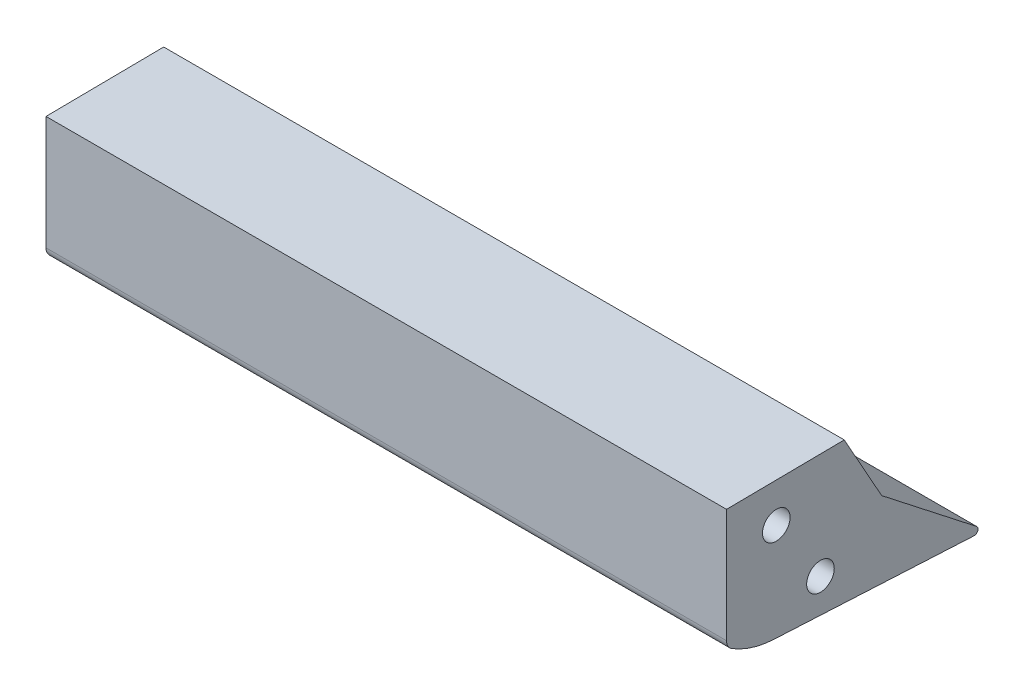
ISO-10303-21;
HEADER;
FILE_DESCRIPTION(('STEP AP214'),'2;1');
FILE_NAME('part.step','',(''),(''),'','','');
FILE_SCHEMA(('AUTOMOTIVE_DESIGN { 1 0 10303 214 1 1 1 1 }'));
ENDSEC;
DATA;
#1=APPLICATION_CONTEXT('core data for automotive mechanical design processes');
#2=APPLICATION_PROTOCOL_DEFINITION('international standard','automotive_design',2000,#1);
#3=PRODUCT_CONTEXT('',#1,'mechanical');
#4=PRODUCT('Part','Part','',(#3));
#5=PRODUCT_RELATED_PRODUCT_CATEGORY('part','',(#4));
#6=PRODUCT_DEFINITION_FORMATION('','',#4);
#7=PRODUCT_DEFINITION_CONTEXT('part definition',#1,'design');
#8=PRODUCT_DEFINITION('design','',#6,#7);
#9=PRODUCT_DEFINITION_SHAPE('','',#8);
#10=(LENGTH_UNIT() NAMED_UNIT(*) SI_UNIT(.MILLI.,.METRE.));
#11=(NAMED_UNIT(*) PLANE_ANGLE_UNIT() SI_UNIT($,.RADIAN.));
#12=(NAMED_UNIT(*) SI_UNIT($,.STERADIAN.) SOLID_ANGLE_UNIT());
#13=UNCERTAINTY_MEASURE_WITH_UNIT(LENGTH_MEASURE(1.E-05),#10,'distance_accuracy_value','');
#14=(GEOMETRIC_REPRESENTATION_CONTEXT(3) GLOBAL_UNCERTAINTY_ASSIGNED_CONTEXT((#13)) GLOBAL_UNIT_ASSIGNED_CONTEXT((#10,
#11,#12)) REPRESENTATION_CONTEXT('',''));
#15=CARTESIAN_POINT('',(0.,0.,0.));
#16=DIRECTION('',(0.,0.,1.));
#17=DIRECTION('',(1.,0.,0.));
#18=AXIS2_PLACEMENT_3D('',#15,#16,#17);
#19=CARTESIAN_POINT('',(31.3,-7.86547622084393,1.45));
#20=DIRECTION('',(0.,0.,-1.));
#21=DIRECTION('',(0.,1.,0.));
#22=AXIS2_PLACEMENT_3D('',#19,#20,#21);
#23=PLANE('',#22);
#24=DIRECTION('',(0.,1.,0.));
#25=VECTOR('',#24,1.);
#26=CARTESIAN_POINT('',(-30.8,-7.86547622084393,1.45));
#27=LINE('',#26,#25);
#28=CARTESIAN_POINT('',(-30.8,-18.1662266030795,1.45));
#29=VERTEX_POINT('',#28);
#30=CARTESIAN_POINT('',(-30.8,-7.86547622084393,1.45));
#31=VERTEX_POINT('',#30);
#32=EDGE_CURVE('E169',#29,#31,#27,.T.);
#33=ORIENTED_EDGE('',*,*,#32,.F.);
#34=DIRECTION('',(1.,0.,0.));
#35=VECTOR('',#34,1.);
#36=CARTESIAN_POINT('',(31.3,-18.1662266030795,1.45));
#37=LINE('',#36,#35);
#38=CARTESIAN_POINT('',(30.8,-18.1662266030795,1.45));
#39=VERTEX_POINT('',#38);
#40=EDGE_CURVE('E200',#29,#39,#37,.T.);
#41=ORIENTED_EDGE('',*,*,#40,.T.);
#42=DIRECTION('',(0.,-1.,0.));
#43=VECTOR('',#42,1.);
#44=CARTESIAN_POINT('',(30.8,-7.86547622084393,1.45));
#45=LINE('',#44,#43);
#46=CARTESIAN_POINT('',(30.8,-7.86547622084393,1.45));
#47=VERTEX_POINT('',#46);
#48=EDGE_CURVE('E178',#47,#39,#45,.T.);
#49=ORIENTED_EDGE('',*,*,#48,.F.);
#50=DIRECTION('',(-1.,0.,0.));
#51=VECTOR('',#50,1.);
#52=CARTESIAN_POINT('',(31.3,-7.86547622084393,1.45));
#53=LINE('',#52,#51);
#54=EDGE_CURVE('E190',#47,#31,#53,.T.);
#55=ORIENTED_EDGE('',*,*,#54,.T.);
#56=EDGE_LOOP('',(#33,#41,#49,#55));
#57=FACE_BOUND('',#56,.T.);
#58=ADVANCED_FACE('F40',(#57),#23,.F.);
#59=CARTESIAN_POINT('',(31.3,-21.2,-22.05));
#60=DIRECTION('',(0.,-0.788010753606726,0.615661475325653));
#61=DIRECTION('',(0.,-0.615661475325653,-0.788010753606726));
#62=AXIS2_PLACEMENT_3D('',#59,#60,#61);
#63=PLANE('',#62);
#64=DIRECTION('',(0.,0.615661475325653,0.788010753606726));
#65=VECTOR('',#64,1.);
#66=CARTESIAN_POINT('',(30.8,-21.2,-22.05));
#67=LINE('',#66,#65);
#68=CARTESIAN_POINT('',(30.8,-20.5170829651128,-21.175906055714));
#69=VERTEX_POINT('',#68);
#70=CARTESIAN_POINT('',(30.8,-13.8120622960922,-12.5938709567193));
#71=VERTEX_POINT('',#70);
#72=EDGE_CURVE('E175',#69,#71,#67,.T.);
#73=ORIENTED_EDGE('',*,*,#72,.F.);
#74=DIRECTION('',(-1.,0.,0.));
#75=VECTOR('',#74,1.);
#76=CARTESIAN_POINT('',(31.3,-20.5170829651128,-21.175906055714));
#77=LINE('',#76,#75);
#78=CARTESIAN_POINT('',(-30.8,-20.5170829651128,-21.175906055714));
#79=VERTEX_POINT('',#78);
#80=EDGE_CURVE('E212',#69,#79,#77,.T.);
#81=ORIENTED_EDGE('',*,*,#80,.T.);
#82=DIRECTION('',(0.,-0.615661475325653,-0.788010753606726));
#83=VECTOR('',#82,1.);
#84=CARTESIAN_POINT('',(-30.8,-21.2,-22.05));
#85=LINE('',#84,#83);
#86=CARTESIAN_POINT('',(-30.8,-13.8120622960922,-12.5938709567193));
#87=VERTEX_POINT('',#86);
#88=EDGE_CURVE('E166',#87,#79,#85,.T.);
#89=ORIENTED_EDGE('',*,*,#88,.F.);
#90=DIRECTION('',(-1.,0.,0.));
#91=VECTOR('',#90,1.);
#92=CARTESIAN_POINT('',(31.3,-13.8120622960922,-12.5938709567193));
#93=LINE('',#92,#91);
#94=EDGE_CURVE('E186',#71,#87,#93,.T.);
#95=ORIENTED_EDGE('',*,*,#94,.F.);
#96=EDGE_LOOP('',(#73,#81,#89,#95));
#97=FACE_BOUND('',#96,.T.);
#98=ADVANCED_FACE('F222',(#97),#63,.F.);
#99=CARTESIAN_POINT('',(31.3,-13.8120622960922,-12.5938709567193));
#100=DIRECTION('',(0.,-0.488105188612672,0.872784810161925));
#101=DIRECTION('',(0.,-0.872784810161925,-0.488105188612672));
#102=AXIS2_PLACEMENT_3D('',#99,#100,#101);
#103=PLANE('',#102);
#104=DIRECTION('',(0.,0.872784810161925,0.488105188612672));
#105=VECTOR('',#104,1.);
#106=CARTESIAN_POINT('',(30.8,-13.8120622960922,-12.5938709567193));
#107=LINE('',#106,#105);
#108=CARTESIAN_POINT('',(30.8,-7.75,-9.20366064833083));
#109=VERTEX_POINT('',#108);
#110=EDGE_CURVE('E172',#71,#109,#107,.T.);
#111=ORIENTED_EDGE('',*,*,#110,.F.);
#112=ORIENTED_EDGE('',*,*,#94,.T.);
#113=DIRECTION('',(0.,-0.872784810161925,-0.488105188612672));
#114=VECTOR('',#113,1.);
#115=CARTESIAN_POINT('',(-30.8,-13.8120622960922,-12.5938709567193));
#116=LINE('',#115,#114);
#117=CARTESIAN_POINT('',(-30.8,-7.75,-9.20366064833083));
#118=VERTEX_POINT('',#117);
#119=EDGE_CURVE('E152',#118,#87,#116,.T.);
#120=ORIENTED_EDGE('',*,*,#119,.F.);
#121=DIRECTION('',(-1.,0.,0.));
#122=VECTOR('',#121,1.);
#123=CARTESIAN_POINT('',(-28.8,-7.75,-9.20366064833083));
#124=LINE('',#123,#122);
#125=EDGE_CURVE('E182',#109,#118,#124,.T.);
#126=ORIENTED_EDGE('',*,*,#125,.F.);
#127=EDGE_LOOP('',(#111,#112,#120,#126));
#128=FACE_BOUND('',#127,.T.);
#129=ADVANCED_FACE('F231',(#128),#103,.F.);
#130=CARTESIAN_POINT('',(-31.3,-7.86547622084393,1.45));
#131=DIRECTION('',(0.,-0.999941262001295,-0.0108384753197404));
#132=DIRECTION('',(0.,0.0108384753197404,-0.999941262001296));
#133=AXIS2_PLACEMENT_3D('',#130,#131,#132);
#134=PLANE('',#133);
#135=DIRECTION('',(0.,-0.0108384753197404,0.999941262001296));
#136=VECTOR('',#135,1.);
#137=CARTESIAN_POINT('',(30.8,-7.86547622084393,1.45));
#138=LINE('',#137,#136);
#139=EDGE_CURVE('E197',#109,#47,#138,.T.);
#140=ORIENTED_EDGE('',*,*,#139,.F.);
#141=ORIENTED_EDGE('',*,*,#125,.T.);
#142=DIRECTION('',(0.,0.0108384753197404,-0.999941262001296));
#143=VECTOR('',#142,1.);
#144=CARTESIAN_POINT('',(-30.8,-7.86547622084393,1.45));
#145=LINE('',#144,#143);
#146=EDGE_CURVE('E194',#31,#118,#145,.T.);
#147=ORIENTED_EDGE('',*,*,#146,.F.);
#148=ORIENTED_EDGE('',*,*,#54,.F.);
#149=EDGE_LOOP('',(#140,#141,#147,#148));
#150=FACE_BOUND('',#149,.T.);
#151=ADVANCED_FACE('F234',(#150),#134,.F.);
#152=CARTESIAN_POINT('',(-30.8,-21.7163217514774,25.585060148241));
#153=DIRECTION('',(-1.,0.,0.));
#154=DIRECTION('',(0.,0.,1.));
#155=AXIS2_PLACEMENT_3D('',#152,#153,#154);
#156=PLANE('',#155);
#157=ORIENTED_EDGE('',*,*,#88,.T.);
#158=CARTESIAN_POINT('',(-30.8,-20.7928867288751,-20.96042453935));
#159=DIRECTION('',(-1.,0.,0.));
#160=DIRECTION('',(0.,0.,1.));
#161=AXIS2_PLACEMENT_3D('',#158,#159,#160);
#162=CIRCLE('',#161,0.35);
#163=CARTESIAN_POINT('',(-30.8,-21.1424147732283,-20.9422546133546));
#164=VERTEX_POINT('',#163);
#165=EDGE_CURVE('E63',#79,#164,#162,.T.);
#166=ORIENTED_EDGE('',*,*,#165,.T.);
#167=DIRECTION('',(0.,0.0519140742727238,0.998651555294641));
#168=VECTOR('',#167,1.);
#169=CARTESIAN_POINT('',(-30.8,-21.2,-22.05));
#170=LINE('',#169,#168);
#171=CARTESIAN_POINT('',(-30.8,-20.2,-2.81337545675272));
#172=VERTEX_POINT('',#171);
#173=EDGE_CURVE('E102',#164,#172,#170,.T.);
#174=ORIENTED_EDGE('',*,*,#173,.T.);
#175=CARTESIAN_POINT('',(-30.8,-12.2107875576429,-3.22868805093451));
#176=DIRECTION('',(-1.,0.,0.));
#177=DIRECTION('',(0.,0.,1.));
#178=AXIS2_PLACEMENT_3D('',#175,#176,#177);
#179=CIRCLE('',#178,8.);
#180=CARTESIAN_POINT('',(-30.8,-19.0170036095705,0.975526864419214));
#181=VERTEX_POINT('',#180);
#182=EDGE_CURVE('E107',#172,#181,#179,.T.);
#183=ORIENTED_EDGE('',*,*,#182,.T.);
#184=CARTESIAN_POINT('',(-30.8,-18.1662266030795,0.449999999999998));
#185=DIRECTION('',(-1.,0.,0.));
#186=DIRECTION('',(0.,0.,1.));
#187=AXIS2_PLACEMENT_3D('',#184,#185,#186);
#188=CIRCLE('',#187,1.);
#189=EDGE_CURVE('E209',#181,#29,#188,.T.);
#190=ORIENTED_EDGE('',*,*,#189,.T.);
#191=ORIENTED_EDGE('',*,*,#32,.T.);
#192=ORIENTED_EDGE('',*,*,#146,.T.);
#193=ORIENTED_EDGE('',*,*,#119,.T.);
#194=EDGE_LOOP('',(#157,#166,#174,#183,#190,#191,#192,#193));
#195=FACE_BOUND('',#194,.T.);
#196=CARTESIAN_POINT('',(-30.8,-17.3654762208439,-7.04999999999952));
#197=DIRECTION('',(-1.,0.,0.));
#198=DIRECTION('',(0.,-1.,0.));
#199=AXIS2_PLACEMENT_3D('',#196,#197,#198);
#200=CIRCLE('',#199,1.25);
#201=CARTESIAN_POINT('',(-30.8,-18.6154762208439,-7.04999999999952));
#202=VERTEX_POINT('',#201);
#203=EDGE_CURVE('E137',#202,#202,#200,.T.);
#204=ORIENTED_EDGE('',*,*,#203,.F.);
#205=EDGE_LOOP('',(#204));
#206=FACE_BOUND('',#205,.T.);
#207=CARTESIAN_POINT('',(-30.8,-11.3654762208439,-3.04999999999952));
#208=DIRECTION('',(-1.,0.,0.));
#209=DIRECTION('',(0.,-1.,0.));
#210=AXIS2_PLACEMENT_3D('',#207,#208,#209);
#211=CIRCLE('',#210,1.25);
#212=CARTESIAN_POINT('',(-30.8,-12.6154762208439,-3.04999999999952));
#213=VERTEX_POINT('',#212);
#214=EDGE_CURVE('E120',#213,#213,#211,.T.);
#215=ORIENTED_EDGE('',*,*,#214,.F.);
#216=EDGE_LOOP('',(#215));
#217=FACE_BOUND('',#216,.T.);
#218=ADVANCED_FACE('F104',(#195,#206,#217),#156,.T.);
#219=CARTESIAN_POINT('',(30.8,-21.7163217514774,25.585060148241));
#220=DIRECTION('',(1.,0.,0.));
#221=DIRECTION('',(0.,0.,-1.));
#222=AXIS2_PLACEMENT_3D('',#219,#220,#221);
#223=PLANE('',#222);
#224=DIRECTION('',(0.,0.0519140742727238,0.998651555294641));
#225=VECTOR('',#224,1.);
#226=CARTESIAN_POINT('',(30.8,-21.2,-22.05));
#227=LINE('',#226,#225);
#228=CARTESIAN_POINT('',(30.8,-21.1424147732283,-20.9422546133546));
#229=VERTEX_POINT('',#228);
#230=CARTESIAN_POINT('',(30.8,-20.2,-2.81337545675272));
#231=VERTEX_POINT('',#230);
#232=EDGE_CURVE('E115',#229,#231,#227,.T.);
#233=ORIENTED_EDGE('',*,*,#232,.F.);
#234=CARTESIAN_POINT('',(30.8,-20.7928867288751,-20.96042453935));
#235=DIRECTION('',(1.,0.,0.));
#236=DIRECTION('',(0.,0.,-1.));
#237=AXIS2_PLACEMENT_3D('',#234,#235,#236);
#238=CIRCLE('',#237,0.35);
#239=EDGE_CURVE('E11',#229,#69,#238,.T.);
#240=ORIENTED_EDGE('',*,*,#239,.T.);
#241=ORIENTED_EDGE('',*,*,#72,.T.);
#242=ORIENTED_EDGE('',*,*,#110,.T.);
#243=ORIENTED_EDGE('',*,*,#139,.T.);
#244=ORIENTED_EDGE('',*,*,#48,.T.);
#245=CARTESIAN_POINT('',(30.8,-18.1662266030795,0.449999999999998));
#246=DIRECTION('',(1.,0.,0.));
#247=DIRECTION('',(0.,0.,-1.));
#248=AXIS2_PLACEMENT_3D('',#245,#246,#247);
#249=CIRCLE('',#248,1.);
#250=CARTESIAN_POINT('',(30.8,-19.0170036095705,0.975526864419214));
#251=VERTEX_POINT('',#250);
#252=EDGE_CURVE('E204',#39,#251,#249,.T.);
#253=ORIENTED_EDGE('',*,*,#252,.T.);
#254=CARTESIAN_POINT('',(30.8,-12.2107875576429,-3.22868805093451));
#255=DIRECTION('',(-1.,0.,0.));
#256=DIRECTION('',(0.,0.,1.));
#257=AXIS2_PLACEMENT_3D('',#254,#255,#256);
#258=CIRCLE('',#257,8.);
#259=EDGE_CURVE('E110',#231,#251,#258,.T.);
#260=ORIENTED_EDGE('',*,*,#259,.F.);
#261=EDGE_LOOP('',(#233,#240,#241,#242,#243,#244,#253,#260));
#262=FACE_BOUND('',#261,.T.);
#263=CARTESIAN_POINT('',(30.8,-11.3654762208439,-3.04999999999952));
#264=DIRECTION('',(1.,0.,0.));
#265=DIRECTION('',(0.,1.,0.));
#266=AXIS2_PLACEMENT_3D('',#263,#264,#265);
#267=CIRCLE('',#266,1.25);
#268=CARTESIAN_POINT('',(30.8,-10.1154762208439,-3.04999999999952));
#269=VERTEX_POINT('',#268);
#270=EDGE_CURVE('E153',#269,#269,#267,.T.);
#271=ORIENTED_EDGE('',*,*,#270,.F.);
#272=EDGE_LOOP('',(#271));
#273=FACE_BOUND('',#272,.T.);
#274=CARTESIAN_POINT('',(30.8,-17.3654762208439,-7.04999999999952));
#275=DIRECTION('',(1.,0.,0.));
#276=DIRECTION('',(0.,1.,0.));
#277=AXIS2_PLACEMENT_3D('',#274,#275,#276);
#278=CIRCLE('',#277,1.25);
#279=CARTESIAN_POINT('',(30.8,-16.1154762208439,-7.04999999999952));
#280=VERTEX_POINT('',#279);
#281=EDGE_CURVE('E136',#280,#280,#278,.T.);
#282=ORIENTED_EDGE('',*,*,#281,.F.);
#283=EDGE_LOOP('',(#282));
#284=FACE_BOUND('',#283,.T.);
#285=ADVANCED_FACE('F238',(#262,#273,#284),#223,.T.);
#286=CARTESIAN_POINT('',(18.8,-17.3654762208439,-7.04999999999952));
#287=DIRECTION('',(1.,0.,0.));
#288=DIRECTION('',(0.,1.,0.));
#289=AXIS2_PLACEMENT_3D('',#286,#287,#288);
#290=CYLINDRICAL_SURFACE('',#289,1.25);
#291=CARTESIAN_POINT('',(18.8,-17.3654762208439,-7.04999999999952));
#292=DIRECTION('',(1.,0.,0.));
#293=DIRECTION('',(0.,1.,0.));
#294=AXIS2_PLACEMENT_3D('',#291,#292,#293);
#295=CIRCLE('',#294,1.25);
#296=CARTESIAN_POINT('',(18.8,-16.1154762208439,-7.04999999999952));
#297=VERTEX_POINT('',#296);
#298=EDGE_CURVE('E157',#297,#297,#295,.T.);
#299=ORIENTED_EDGE('',*,*,#298,.F.);
#300=EDGE_LOOP('',(#299));
#301=FACE_BOUND('',#300,.T.);
#302=ORIENTED_EDGE('',*,*,#281,.T.);
#303=EDGE_LOOP('',(#302));
#304=FACE_BOUND('',#303,.T.);
#305=ADVANCED_FACE('F264',(#301,#304),#290,.F.);
#306=CARTESIAN_POINT('',(18.8,-17.3654762208439,-7.04999999999952));
#307=DIRECTION('',(1.,0.,0.));
#308=DIRECTION('',(0.,1.,0.));
#309=AXIS2_PLACEMENT_3D('',#306,#307,#308);
#310=PLANE('',#309);
#311=ORIENTED_EDGE('',*,*,#298,.T.);
#312=EDGE_LOOP('',(#311));
#313=FACE_BOUND('',#312,.T.);
#314=ADVANCED_FACE('F269',(#313),#310,.T.);
#315=CARTESIAN_POINT('',(18.8,-11.3654762208439,-3.04999999999952));
#316=DIRECTION('',(1.,0.,0.));
#317=DIRECTION('',(0.,1.,0.));
#318=AXIS2_PLACEMENT_3D('',#315,#316,#317);
#319=CYLINDRICAL_SURFACE('',#318,1.25);
#320=CARTESIAN_POINT('',(18.8,-11.3654762208439,-3.04999999999952));
#321=DIRECTION('',(1.,0.,0.));
#322=DIRECTION('',(0.,1.,0.));
#323=AXIS2_PLACEMENT_3D('',#320,#321,#322);
#324=CIRCLE('',#323,1.25);
#325=CARTESIAN_POINT('',(18.8,-10.1154762208439,-3.04999999999952));
#326=VERTEX_POINT('',#325);
#327=EDGE_CURVE('E148',#326,#326,#324,.T.);
#328=ORIENTED_EDGE('',*,*,#327,.F.);
#329=EDGE_LOOP('',(#328));
#330=FACE_BOUND('',#329,.T.);
#331=ORIENTED_EDGE('',*,*,#270,.T.);
#332=EDGE_LOOP('',(#331));
#333=FACE_BOUND('',#332,.T.);
#334=ADVANCED_FACE('F273',(#330,#333),#319,.F.);
#335=CARTESIAN_POINT('',(18.8,-11.3654762208439,-3.04999999999952));
#336=DIRECTION('',(1.,0.,0.));
#337=DIRECTION('',(0.,1.,0.));
#338=AXIS2_PLACEMENT_3D('',#335,#336,#337);
#339=PLANE('',#338);
#340=ORIENTED_EDGE('',*,*,#327,.T.);
#341=EDGE_LOOP('',(#340));
#342=FACE_BOUND('',#341,.T.);
#343=ADVANCED_FACE('F277',(#342),#339,.T.);
#344=CARTESIAN_POINT('',(-18.8,-11.3654762208439,-3.04999999999952));
#345=DIRECTION('',(-1.,0.,0.));
#346=DIRECTION('',(0.,-1.,0.));
#347=AXIS2_PLACEMENT_3D('',#344,#345,#346);
#348=CYLINDRICAL_SURFACE('',#347,1.25);
#349=CARTESIAN_POINT('',(-18.8,-11.3654762208439,-3.04999999999952));
#350=DIRECTION('',(-1.,0.,0.));
#351=DIRECTION('',(0.,-1.,0.));
#352=AXIS2_PLACEMENT_3D('',#349,#350,#351);
#353=CIRCLE('',#352,1.25);
#354=CARTESIAN_POINT('',(-18.8,-12.6154762208439,-3.04999999999952));
#355=VERTEX_POINT('',#354);
#356=EDGE_CURVE('E141',#355,#355,#353,.T.);
#357=ORIENTED_EDGE('',*,*,#356,.F.);
#358=EDGE_LOOP('',(#357));
#359=FACE_BOUND('',#358,.T.);
#360=ORIENTED_EDGE('',*,*,#214,.T.);
#361=EDGE_LOOP('',(#360));
#362=FACE_BOUND('',#361,.T.);
#363=ADVANCED_FACE('F281',(#359,#362),#348,.F.);
#364=CARTESIAN_POINT('',(-18.8,-11.3654762208439,-3.04999999999952));
#365=DIRECTION('',(-1.,0.,0.));
#366=DIRECTION('',(0.,-1.,0.));
#367=AXIS2_PLACEMENT_3D('',#364,#365,#366);
#368=PLANE('',#367);
#369=ORIENTED_EDGE('',*,*,#356,.T.);
#370=EDGE_LOOP('',(#369));
#371=FACE_BOUND('',#370,.T.);
#372=ADVANCED_FACE('F285',(#371),#368,.T.);
#373=CARTESIAN_POINT('',(-18.8,-17.3654762208439,-7.04999999999952));
#374=DIRECTION('',(-1.,0.,0.));
#375=DIRECTION('',(0.,-1.,0.));
#376=AXIS2_PLACEMENT_3D('',#373,#374,#375);
#377=CYLINDRICAL_SURFACE('',#376,1.25);
#378=CARTESIAN_POINT('',(-18.8,-17.3654762208439,-7.04999999999952));
#379=DIRECTION('',(-1.,0.,0.));
#380=DIRECTION('',(0.,-1.,0.));
#381=AXIS2_PLACEMENT_3D('',#378,#379,#380);
#382=CIRCLE('',#381,1.25);
#383=CARTESIAN_POINT('',(-18.8,-18.6154762208439,-7.04999999999952));
#384=VERTEX_POINT('',#383);
#385=EDGE_CURVE('E132',#384,#384,#382,.T.);
#386=ORIENTED_EDGE('',*,*,#385,.F.);
#387=EDGE_LOOP('',(#386));
#388=FACE_BOUND('',#387,.T.);
#389=ORIENTED_EDGE('',*,*,#203,.T.);
#390=EDGE_LOOP('',(#389));
#391=FACE_BOUND('',#390,.T.);
#392=ADVANCED_FACE('F289',(#388,#391),#377,.F.);
#393=CARTESIAN_POINT('',(-18.8,-17.3654762208439,-7.04999999999952));
#394=DIRECTION('',(-1.,0.,0.));
#395=DIRECTION('',(0.,-1.,0.));
#396=AXIS2_PLACEMENT_3D('',#393,#394,#395);
#397=PLANE('',#396);
#398=ORIENTED_EDGE('',*,*,#385,.T.);
#399=EDGE_LOOP('',(#398));
#400=FACE_BOUND('',#399,.T.);
#401=ADVANCED_FACE('F293',(#400),#397,.T.);
#402=CARTESIAN_POINT('',(-30.8,-12.2107875576429,-3.22868805093451));
#403=DIRECTION('',(1.,0.,0.));
#404=DIRECTION('',(0.,0.,-1.));
#405=AXIS2_PLACEMENT_3D('',#402,#403,#404);
#406=CYLINDRICAL_SURFACE('',#405,8.);
#407=ORIENTED_EDGE('',*,*,#259,.T.);
#408=DIRECTION('',(1.,0.,0.));
#409=VECTOR('',#408,1.);
#410=CARTESIAN_POINT('',(-30.8,-19.0170036095705,0.975526864419215));
#411=LINE('',#410,#409);
#412=EDGE_CURVE('E124',#251,#181,#411,.F.);
#413=ORIENTED_EDGE('',*,*,#412,.T.);
#414=ORIENTED_EDGE('',*,*,#182,.F.);
#415=DIRECTION('',(1.,0.,0.));
#416=VECTOR('',#415,1.);
#417=CARTESIAN_POINT('',(-30.8,-20.2,-2.81337545675272));
#418=LINE('',#417,#416);
#419=EDGE_CURVE('E113',#172,#231,#418,.T.);
#420=ORIENTED_EDGE('',*,*,#419,.T.);
#421=EDGE_LOOP('',(#407,#413,#414,#420));
#422=FACE_BOUND('',#421,.T.);
#423=ADVANCED_FACE('F122',(#422),#406,.T.);
#424=CARTESIAN_POINT('',(-30.8,-21.2,-22.05));
#425=DIRECTION('',(0.,0.998651555294641,-0.0519140742727238));
#426=DIRECTION('',(0.,0.0519140742727238,0.998651555294641));
#427=AXIS2_PLACEMENT_3D('',#424,#425,#426);
#428=PLANE('',#427);
#429=ORIENTED_EDGE('',*,*,#173,.F.);
#430=DIRECTION('',(-1.,0.,0.));
#431=VECTOR('',#430,1.);
#432=CARTESIAN_POINT('',(-30.8,-21.1424147732283,-20.9422546133546));
#433=LINE('',#432,#431);
#434=EDGE_CURVE('E49',#164,#229,#433,.F.);
#435=ORIENTED_EDGE('',*,*,#434,.T.);
#436=ORIENTED_EDGE('',*,*,#232,.T.);
#437=ORIENTED_EDGE('',*,*,#419,.F.);
#438=EDGE_LOOP('',(#429,#435,#436,#437));
#439=FACE_BOUND('',#438,.T.);
#440=ADVANCED_FACE('F114',(#439),#428,.F.);
#441=CARTESIAN_POINT('',(-30.8,-18.1662266030795,0.449999999999998));
#442=DIRECTION('',(1.,0.,0.));
#443=DIRECTION('',(0.,0.,-1.));
#444=AXIS2_PLACEMENT_3D('',#441,#442,#443);
#445=CYLINDRICAL_SURFACE('',#444,1.);
#446=ORIENTED_EDGE('',*,*,#189,.F.);
#447=ORIENTED_EDGE('',*,*,#412,.F.);
#448=ORIENTED_EDGE('',*,*,#252,.F.);
#449=ORIENTED_EDGE('',*,*,#40,.F.);
#450=EDGE_LOOP('',(#446,#447,#448,#449));
#451=FACE_BOUND('',#450,.T.);
#452=ADVANCED_FACE('F244',(#451),#445,.T.);
#453=CARTESIAN_POINT('',(31.3,-20.7928867288751,-20.96042453935));
#454=DIRECTION('',(-1.,0.,0.));
#455=DIRECTION('',(0.,0.,1.));
#456=AXIS2_PLACEMENT_3D('',#453,#454,#455);
#457=CYLINDRICAL_SURFACE('',#456,0.35);
#458=ORIENTED_EDGE('',*,*,#239,.F.);
#459=ORIENTED_EDGE('',*,*,#434,.F.);
#460=ORIENTED_EDGE('',*,*,#165,.F.);
#461=ORIENTED_EDGE('',*,*,#80,.F.);
#462=EDGE_LOOP('',(#458,#459,#460,#461));
#463=FACE_BOUND('',#462,.T.);
#464=ADVANCED_FACE('F42',(#463),#457,.T.);
#465=CLOSED_SHELL('',(#58,#98,#129,#151,#218,#285,#305,#314,#334,#343,#363,#372,#392,#401,#423,
#440,#452,#464));
#466=MANIFOLD_SOLID_BREP('B2',#465);
#467=ADVANCED_BREP_SHAPE_REPRESENTATION('',(#18,#466),#14);
#468=SHAPE_DEFINITION_REPRESENTATION(#9,#467);
ENDSEC;
END-ISO-10303-21;
